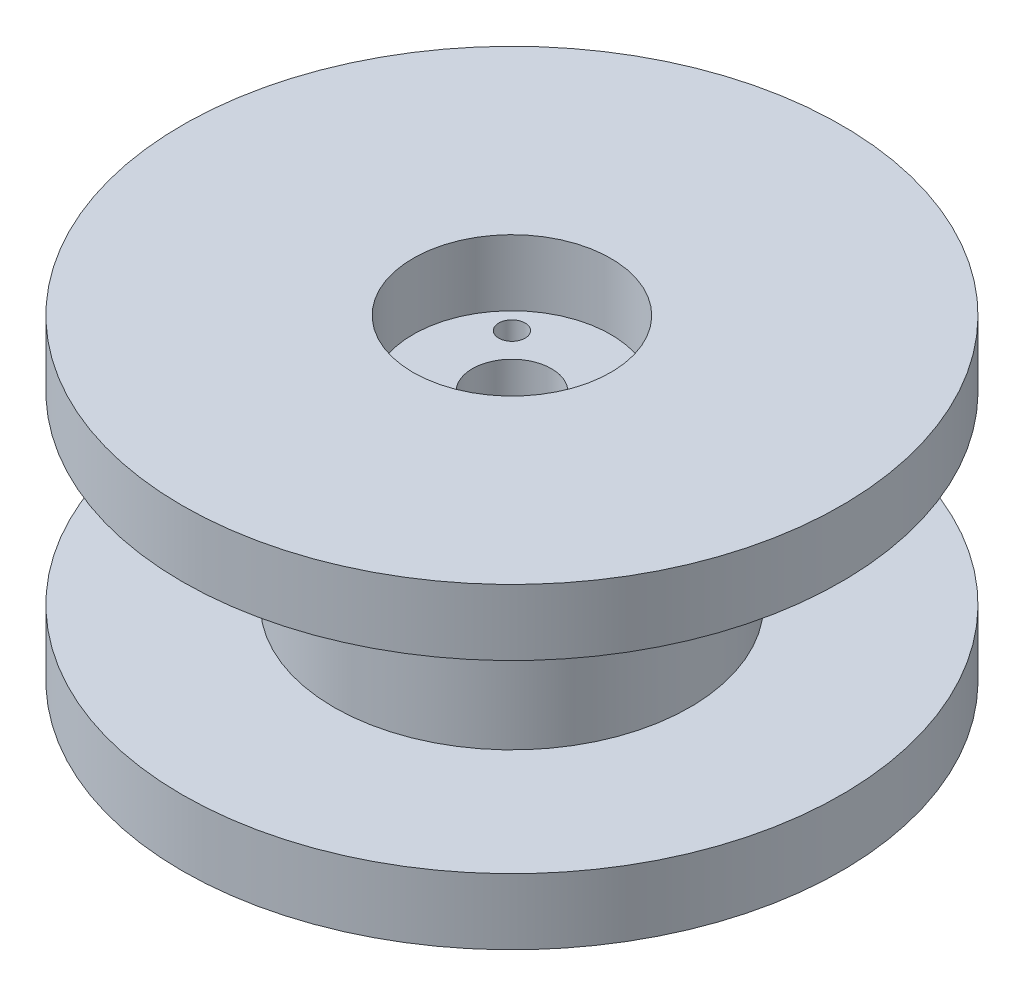
ISO-10303-21;
HEADER;
FILE_DESCRIPTION(('STEP AP214'),'2;1');
FILE_NAME('part.step','',(''),(''),'','','');
FILE_SCHEMA(('AUTOMOTIVE_DESIGN { 1 0 10303 214 1 1 1 1 }'));
ENDSEC;
DATA;
#1=APPLICATION_CONTEXT('core data for automotive mechanical design processes');
#2=APPLICATION_PROTOCOL_DEFINITION('international standard','automotive_design',2000,#1);
#3=PRODUCT_CONTEXT('',#1,'mechanical');
#4=PRODUCT('Part','Part','',(#3));
#5=PRODUCT_RELATED_PRODUCT_CATEGORY('part','',(#4));
#6=PRODUCT_DEFINITION_FORMATION('','',#4);
#7=PRODUCT_DEFINITION_CONTEXT('part definition',#1,'design');
#8=PRODUCT_DEFINITION('design','',#6,#7);
#9=PRODUCT_DEFINITION_SHAPE('','',#8);
#10=(LENGTH_UNIT() NAMED_UNIT(*) SI_UNIT(.MILLI.,.METRE.));
#11=(NAMED_UNIT(*) PLANE_ANGLE_UNIT() SI_UNIT($,.RADIAN.));
#12=(NAMED_UNIT(*) SI_UNIT($,.STERADIAN.) SOLID_ANGLE_UNIT());
#13=UNCERTAINTY_MEASURE_WITH_UNIT(LENGTH_MEASURE(1.E-05),#10,'distance_accuracy_value','');
#14=(GEOMETRIC_REPRESENTATION_CONTEXT(3) GLOBAL_UNCERTAINTY_ASSIGNED_CONTEXT((#13)) GLOBAL_UNIT_ASSIGNED_CONTEXT((#10,
#11,#12)) REPRESENTATION_CONTEXT('',''));
#15=CARTESIAN_POINT('',(0.,0.,0.));
#16=DIRECTION('',(0.,0.,1.));
#17=DIRECTION('',(1.,0.,0.));
#18=AXIS2_PLACEMENT_3D('',#15,#16,#17);
#19=CARTESIAN_POINT('',(0.,-7.,7.5));
#20=DIRECTION('',(0.,-1.,0.));
#21=DIRECTION('',(0.,0.,-1.));
#22=AXIS2_PLACEMENT_3D('',#19,#20,#21);
#23=PLANE('',#22);
#24=CARTESIAN_POINT('',(4.,-7.,4.));
#25=DIRECTION('',(0.,-1.,0.));
#26=DIRECTION('',(0.,0.,-1.));
#27=AXIS2_PLACEMENT_3D('',#24,#25,#26);
#28=CIRCLE('',#27,1.);
#29=CARTESIAN_POINT('',(4.,-7.,3.));
#30=VERTEX_POINT('',#29);
#31=EDGE_CURVE('E86',#30,#30,#28,.T.);
#32=ORIENTED_EDGE('',*,*,#31,.F.);
#33=EDGE_LOOP('',(#32));
#34=FACE_BOUND('',#33,.T.);
#35=CARTESIAN_POINT('',(-4.,-7.,4.));
#36=DIRECTION('',(0.,-1.,0.));
#37=DIRECTION('',(0.,0.,-1.));
#38=AXIS2_PLACEMENT_3D('',#35,#36,#37);
#39=CIRCLE('',#38,1.);
#40=CARTESIAN_POINT('',(-4.,-7.,3.));
#41=VERTEX_POINT('',#40);
#42=EDGE_CURVE('E72',#41,#41,#39,.T.);
#43=ORIENTED_EDGE('',*,*,#42,.F.);
#44=EDGE_LOOP('',(#43));
#45=FACE_BOUND('',#44,.T.);
#46=CARTESIAN_POINT('',(-4.,-7.,-4.));
#47=DIRECTION('',(0.,-1.,0.));
#48=DIRECTION('',(0.,0.,-1.));
#49=AXIS2_PLACEMENT_3D('',#46,#47,#48);
#50=CIRCLE('',#49,1.);
#51=CARTESIAN_POINT('',(-4.,-7.,-5.));
#52=VERTEX_POINT('',#51);
#53=EDGE_CURVE('E68',#52,#52,#50,.T.);
#54=ORIENTED_EDGE('',*,*,#53,.F.);
#55=EDGE_LOOP('',(#54));
#56=FACE_BOUND('',#55,.T.);
#57=CARTESIAN_POINT('',(4.,-7.,-4.));
#58=DIRECTION('',(0.,-1.,0.));
#59=DIRECTION('',(0.,0.,-1.));
#60=AXIS2_PLACEMENT_3D('',#57,#58,#59);
#61=CIRCLE('',#60,1.);
#62=CARTESIAN_POINT('',(4.,-7.,-5.));
#63=VERTEX_POINT('',#62);
#64=EDGE_CURVE('E64',#63,#63,#61,.T.);
#65=ORIENTED_EDGE('',*,*,#64,.F.);
#66=EDGE_LOOP('',(#65));
#67=FACE_BOUND('',#66,.T.);
#68=CARTESIAN_POINT('',(0.,-7.,0.));
#69=DIRECTION('',(0.,-1.,0.));
#70=DIRECTION('',(0.,0.,-1.));
#71=AXIS2_PLACEMENT_3D('',#68,#69,#70);
#72=CIRCLE('',#71,3.);
#73=CARTESIAN_POINT('',(0.,-7.,-3.));
#74=VERTEX_POINT('',#73);
#75=EDGE_CURVE('E59',#74,#74,#72,.T.);
#76=ORIENTED_EDGE('',*,*,#75,.F.);
#77=EDGE_LOOP('',(#76));
#78=FACE_BOUND('',#77,.T.);
#79=CARTESIAN_POINT('',(0.,-7.,0.));
#80=DIRECTION('',(0.,1.,0.));
#81=DIRECTION('',(0.,0.,1.));
#82=AXIS2_PLACEMENT_3D('',#79,#80,#81);
#83=CIRCLE('',#82,7.5);
#84=CARTESIAN_POINT('',(0.,-7.,7.5));
#85=VERTEX_POINT('',#84);
#86=EDGE_CURVE('E10',#85,#85,#83,.T.);
#87=ORIENTED_EDGE('',*,*,#86,.F.);
#88=EDGE_LOOP('',(#87));
#89=FACE_BOUND('',#88,.T.);
#90=ADVANCED_FACE('F37',(#34,#45,#56,#67,#78,#89),#23,.T.);
#91=CARTESIAN_POINT('',(0.,7.,0.));
#92=DIRECTION('',(0.,1.,0.));
#93=DIRECTION('',(0.,0.,1.));
#94=AXIS2_PLACEMENT_3D('',#91,#92,#93);
#95=CYLINDRICAL_SURFACE('',#94,7.5);
#96=ORIENTED_EDGE('',*,*,#86,.T.);
#97=EDGE_LOOP('',(#96));
#98=FACE_BOUND('',#97,.T.);
#99=CARTESIAN_POINT('',(0.,-12.,0.));
#100=DIRECTION('',(0.,1.,0.));
#101=DIRECTION('',(0.,0.,1.));
#102=AXIS2_PLACEMENT_3D('',#99,#100,#101);
#103=CIRCLE('',#102,7.5);
#104=CARTESIAN_POINT('',(0.,-12.,7.5));
#105=VERTEX_POINT('',#104);
#106=EDGE_CURVE('E45',#105,#105,#103,.T.);
#107=ORIENTED_EDGE('',*,*,#106,.F.);
#108=EDGE_LOOP('',(#107));
#109=FACE_BOUND('',#108,.T.);
#110=ADVANCED_FACE('F126',(#98,#109),#95,.F.);
#111=CARTESIAN_POINT('',(0.,-12.,7.5));
#112=DIRECTION('',(0.,-1.,0.));
#113=DIRECTION('',(0.,0.,-1.));
#114=AXIS2_PLACEMENT_3D('',#111,#112,#113);
#115=PLANE('',#114);
#116=ORIENTED_EDGE('',*,*,#106,.T.);
#117=EDGE_LOOP('',(#116));
#118=FACE_BOUND('',#117,.T.);
#119=CARTESIAN_POINT('',(0.,-12.,0.));
#120=DIRECTION('',(0.,1.,0.));
#121=DIRECTION('',(0.,0.,1.));
#122=AXIS2_PLACEMENT_3D('',#119,#120,#121);
#123=CIRCLE('',#122,25.);
#124=CARTESIAN_POINT('',(0.,-12.,25.));
#125=VERTEX_POINT('',#124);
#126=EDGE_CURVE('E51',#125,#125,#123,.T.);
#127=ORIENTED_EDGE('',*,*,#126,.F.);
#128=EDGE_LOOP('',(#127));
#129=FACE_BOUND('',#128,.T.);
#130=ADVANCED_FACE('F124',(#118,#129),#115,.T.);
#131=CARTESIAN_POINT('',(0.,7.,0.));
#132=DIRECTION('',(0.,1.,0.));
#133=DIRECTION('',(0.,0.,1.));
#134=AXIS2_PLACEMENT_3D('',#131,#132,#133);
#135=CYLINDRICAL_SURFACE('',#134,25.);
#136=ORIENTED_EDGE('',*,*,#126,.T.);
#137=EDGE_LOOP('',(#136));
#138=FACE_BOUND('',#137,.T.);
#139=CARTESIAN_POINT('',(0.,-7.,0.));
#140=DIRECTION('',(0.,1.,0.));
#141=DIRECTION('',(0.,0.,1.));
#142=AXIS2_PLACEMENT_3D('',#139,#140,#141);
#143=CIRCLE('',#142,25.);
#144=CARTESIAN_POINT('',(0.,-7.,25.));
#145=VERTEX_POINT('',#144);
#146=EDGE_CURVE('E114',#145,#145,#143,.T.);
#147=ORIENTED_EDGE('',*,*,#146,.F.);
#148=EDGE_LOOP('',(#147));
#149=FACE_BOUND('',#148,.T.);
#150=ADVANCED_FACE('F121',(#138,#149),#135,.T.);
#151=CARTESIAN_POINT('',(0.,-7.,25.));
#152=DIRECTION('',(0.,1.,0.));
#153=DIRECTION('',(0.,0.,1.));
#154=AXIS2_PLACEMENT_3D('',#151,#152,#153);
#155=PLANE('',#154);
#156=ORIENTED_EDGE('',*,*,#146,.T.);
#157=EDGE_LOOP('',(#156));
#158=FACE_BOUND('',#157,.T.);
#159=CARTESIAN_POINT('',(0.,-7.,0.));
#160=DIRECTION('',(0.,1.,0.));
#161=DIRECTION('',(0.,0.,1.));
#162=AXIS2_PLACEMENT_3D('',#159,#160,#161);
#163=CIRCLE('',#162,13.5);
#164=CARTESIAN_POINT('',(0.,-7.,13.5));
#165=VERTEX_POINT('',#164);
#166=EDGE_CURVE('E110',#165,#165,#163,.T.);
#167=ORIENTED_EDGE('',*,*,#166,.F.);
#168=EDGE_LOOP('',(#167));
#169=FACE_BOUND('',#168,.T.);
#170=ADVANCED_FACE('F133',(#158,#169),#155,.T.);
#171=CARTESIAN_POINT('',(0.,7.,0.));
#172=DIRECTION('',(0.,1.,0.));
#173=DIRECTION('',(0.,0.,1.));
#174=AXIS2_PLACEMENT_3D('',#171,#172,#173);
#175=CYLINDRICAL_SURFACE('',#174,13.5);
#176=ORIENTED_EDGE('',*,*,#166,.T.);
#177=EDGE_LOOP('',(#176));
#178=FACE_BOUND('',#177,.T.);
#179=CARTESIAN_POINT('',(0.,6.99999999999999,0.));
#180=DIRECTION('',(0.,1.,0.));
#181=DIRECTION('',(0.,0.,1.));
#182=AXIS2_PLACEMENT_3D('',#179,#180,#181);
#183=CIRCLE('',#182,13.5);
#184=CARTESIAN_POINT('',(0.,6.99999999999999,13.5));
#185=VERTEX_POINT('',#184);
#186=EDGE_CURVE('E106',#185,#185,#183,.T.);
#187=ORIENTED_EDGE('',*,*,#186,.F.);
#188=EDGE_LOOP('',(#187));
#189=FACE_BOUND('',#188,.T.);
#190=ADVANCED_FACE('F190',(#178,#189),#175,.T.);
#191=CARTESIAN_POINT('',(0.,7.,25.));
#192=DIRECTION('',(0.,-1.,0.));
#193=DIRECTION('',(0.,0.,-1.));
#194=AXIS2_PLACEMENT_3D('',#191,#192,#193);
#195=PLANE('',#194);
#196=ORIENTED_EDGE('',*,*,#186,.T.);
#197=EDGE_LOOP('',(#196));
#198=FACE_BOUND('',#197,.T.);
#199=CARTESIAN_POINT('',(0.,7.,0.));
#200=DIRECTION('',(0.,1.,0.));
#201=DIRECTION('',(0.,0.,1.));
#202=AXIS2_PLACEMENT_3D('',#199,#200,#201);
#203=CIRCLE('',#202,25.);
#204=CARTESIAN_POINT('',(0.,7.,25.));
#205=VERTEX_POINT('',#204);
#206=EDGE_CURVE('E102',#205,#205,#203,.T.);
#207=ORIENTED_EDGE('',*,*,#206,.F.);
#208=EDGE_LOOP('',(#207));
#209=FACE_BOUND('',#208,.T.);
#210=ADVANCED_FACE('F186',(#198,#209),#195,.T.);
#211=CARTESIAN_POINT('',(0.,7.,0.));
#212=DIRECTION('',(0.,1.,0.));
#213=DIRECTION('',(0.,0.,1.));
#214=AXIS2_PLACEMENT_3D('',#211,#212,#213);
#215=CYLINDRICAL_SURFACE('',#214,25.);
#216=ORIENTED_EDGE('',*,*,#206,.T.);
#217=EDGE_LOOP('',(#216));
#218=FACE_BOUND('',#217,.T.);
#219=CARTESIAN_POINT('',(0.,12.,0.));
#220=DIRECTION('',(0.,1.,0.));
#221=DIRECTION('',(0.,0.,1.));
#222=AXIS2_PLACEMENT_3D('',#219,#220,#221);
#223=CIRCLE('',#222,25.);
#224=CARTESIAN_POINT('',(0.,12.,25.));
#225=VERTEX_POINT('',#224);
#226=EDGE_CURVE('E98',#225,#225,#223,.T.);
#227=ORIENTED_EDGE('',*,*,#226,.F.);
#228=EDGE_LOOP('',(#227));
#229=FACE_BOUND('',#228,.T.);
#230=ADVANCED_FACE('F179',(#218,#229),#215,.T.);
#231=CARTESIAN_POINT('',(0.,12.,7.5));
#232=DIRECTION('',(0.,1.,0.));
#233=DIRECTION('',(0.,0.,1.));
#234=AXIS2_PLACEMENT_3D('',#231,#232,#233);
#235=PLANE('',#234);
#236=ORIENTED_EDGE('',*,*,#226,.T.);
#237=EDGE_LOOP('',(#236));
#238=FACE_BOUND('',#237,.T.);
#239=CARTESIAN_POINT('',(0.,12.,0.));
#240=DIRECTION('',(0.,1.,0.));
#241=DIRECTION('',(0.,0.,1.));
#242=AXIS2_PLACEMENT_3D('',#239,#240,#241);
#243=CIRCLE('',#242,7.5);
#244=CARTESIAN_POINT('',(0.,12.,7.5));
#245=VERTEX_POINT('',#244);
#246=EDGE_CURVE('E94',#245,#245,#243,.T.);
#247=ORIENTED_EDGE('',*,*,#246,.F.);
#248=EDGE_LOOP('',(#247));
#249=FACE_BOUND('',#248,.T.);
#250=ADVANCED_FACE('F173',(#238,#249),#235,.T.);
#251=CARTESIAN_POINT('',(0.,7.,0.));
#252=DIRECTION('',(0.,1.,0.));
#253=DIRECTION('',(0.,0.,1.));
#254=AXIS2_PLACEMENT_3D('',#251,#252,#253);
#255=CYLINDRICAL_SURFACE('',#254,7.5);
#256=ORIENTED_EDGE('',*,*,#246,.T.);
#257=EDGE_LOOP('',(#256));
#258=FACE_BOUND('',#257,.T.);
#259=CARTESIAN_POINT('',(0.,7.,0.));
#260=DIRECTION('',(0.,1.,0.));
#261=DIRECTION('',(0.,0.,1.));
#262=AXIS2_PLACEMENT_3D('',#259,#260,#261);
#263=CIRCLE('',#262,7.5);
#264=CARTESIAN_POINT('',(0.,7.,7.5));
#265=VERTEX_POINT('',#264);
#266=EDGE_CURVE('E90',#265,#265,#263,.T.);
#267=ORIENTED_EDGE('',*,*,#266,.F.);
#268=EDGE_LOOP('',(#267));
#269=FACE_BOUND('',#268,.T.);
#270=ADVANCED_FACE('F165',(#258,#269),#255,.F.);
#271=CARTESIAN_POINT('',(0.,7.,7.5));
#272=DIRECTION('',(0.,1.,0.));
#273=DIRECTION('',(0.,0.,1.));
#274=AXIS2_PLACEMENT_3D('',#271,#272,#273);
#275=PLANE('',#274);
#276=CARTESIAN_POINT('',(4.,7.,4.));
#277=DIRECTION('',(0.,1.,0.));
#278=DIRECTION('',(0.,0.,1.));
#279=AXIS2_PLACEMENT_3D('',#276,#277,#278);
#280=CIRCLE('',#279,1.);
#281=CARTESIAN_POINT('',(4.,7.,5.));
#282=VERTEX_POINT('',#281);
#283=EDGE_CURVE('E40',#282,#282,#280,.T.);
#284=ORIENTED_EDGE('',*,*,#283,.F.);
#285=EDGE_LOOP('',(#284));
#286=FACE_BOUND('',#285,.T.);
#287=CARTESIAN_POINT('',(-4.,7.,4.));
#288=DIRECTION('',(0.,1.,0.));
#289=DIRECTION('',(0.,0.,1.));
#290=AXIS2_PLACEMENT_3D('',#287,#288,#289);
#291=CIRCLE('',#290,1.);
#292=CARTESIAN_POINT('',(-4.,7.,5.));
#293=VERTEX_POINT('',#292);
#294=EDGE_CURVE('E69',#293,#293,#291,.T.);
#295=ORIENTED_EDGE('',*,*,#294,.F.);
#296=EDGE_LOOP('',(#295));
#297=FACE_BOUND('',#296,.T.);
#298=CARTESIAN_POINT('',(-4.,7.,-4.));
#299=DIRECTION('',(0.,1.,0.));
#300=DIRECTION('',(0.,0.,1.));
#301=AXIS2_PLACEMENT_3D('',#298,#299,#300);
#302=CIRCLE('',#301,1.);
#303=CARTESIAN_POINT('',(-4.,7.,-3.));
#304=VERTEX_POINT('',#303);
#305=EDGE_CURVE('E65',#304,#304,#302,.T.);
#306=ORIENTED_EDGE('',*,*,#305,.F.);
#307=EDGE_LOOP('',(#306));
#308=FACE_BOUND('',#307,.T.);
#309=CARTESIAN_POINT('',(4.,7.,-4.));
#310=DIRECTION('',(0.,1.,0.));
#311=DIRECTION('',(0.,0.,1.));
#312=AXIS2_PLACEMENT_3D('',#309,#310,#311);
#313=CIRCLE('',#312,1.);
#314=CARTESIAN_POINT('',(4.,7.,-3.));
#315=VERTEX_POINT('',#314);
#316=EDGE_CURVE('E60',#315,#315,#313,.T.);
#317=ORIENTED_EDGE('',*,*,#316,.F.);
#318=EDGE_LOOP('',(#317));
#319=FACE_BOUND('',#318,.T.);
#320=CARTESIAN_POINT('',(0.,7.,0.));
#321=DIRECTION('',(0.,1.,0.));
#322=DIRECTION('',(0.,0.,1.));
#323=AXIS2_PLACEMENT_3D('',#320,#321,#322);
#324=CIRCLE('',#323,3.);
#325=CARTESIAN_POINT('',(0.,7.,3.));
#326=VERTEX_POINT('',#325);
#327=EDGE_CURVE('E55',#326,#326,#324,.T.);
#328=ORIENTED_EDGE('',*,*,#327,.F.);
#329=EDGE_LOOP('',(#328));
#330=FACE_BOUND('',#329,.T.);
#331=ORIENTED_EDGE('',*,*,#266,.T.);
#332=EDGE_LOOP('',(#331));
#333=FACE_BOUND('',#332,.T.);
#334=ADVANCED_FACE('F162',(#286,#297,#308,#319,#330,#333),#275,.T.);
#335=CARTESIAN_POINT('',(0.,12.,0.));
#336=DIRECTION('',(0.,-1.,0.));
#337=DIRECTION('',(0.,0.,-1.));
#338=AXIS2_PLACEMENT_3D('',#335,#336,#337);
#339=CYLINDRICAL_SURFACE('',#338,3.);
#340=ORIENTED_EDGE('',*,*,#75,.T.);
#341=EDGE_LOOP('',(#340));
#342=FACE_BOUND('',#341,.T.);
#343=ORIENTED_EDGE('',*,*,#327,.T.);
#344=EDGE_LOOP('',(#343));
#345=FACE_BOUND('',#344,.T.);
#346=ADVANCED_FACE('F158',(#342,#345),#339,.F.);
#347=CARTESIAN_POINT('',(4.,12.,-4.));
#348=DIRECTION('',(0.,-1.,0.));
#349=DIRECTION('',(0.,0.,-1.));
#350=AXIS2_PLACEMENT_3D('',#347,#348,#349);
#351=CYLINDRICAL_SURFACE('',#350,1.);
#352=ORIENTED_EDGE('',*,*,#64,.T.);
#353=EDGE_LOOP('',(#352));
#354=FACE_BOUND('',#353,.T.);
#355=ORIENTED_EDGE('',*,*,#316,.T.);
#356=EDGE_LOOP('',(#355));
#357=FACE_BOUND('',#356,.T.);
#358=ADVANCED_FACE('F154',(#354,#357),#351,.F.);
#359=CARTESIAN_POINT('',(-4.,12.,-4.));
#360=DIRECTION('',(0.,-1.,0.));
#361=DIRECTION('',(0.,0.,-1.));
#362=AXIS2_PLACEMENT_3D('',#359,#360,#361);
#363=CYLINDRICAL_SURFACE('',#362,1.);
#364=ORIENTED_EDGE('',*,*,#53,.T.);
#365=EDGE_LOOP('',(#364));
#366=FACE_BOUND('',#365,.T.);
#367=ORIENTED_EDGE('',*,*,#305,.T.);
#368=EDGE_LOOP('',(#367));
#369=FACE_BOUND('',#368,.T.);
#370=ADVANCED_FACE('F157',(#366,#369),#363,.F.);
#371=CARTESIAN_POINT('',(-4.,12.,4.));
#372=DIRECTION('',(0.,-1.,0.));
#373=DIRECTION('',(0.,0.,-1.));
#374=AXIS2_PLACEMENT_3D('',#371,#372,#373);
#375=CYLINDRICAL_SURFACE('',#374,1.);
#376=ORIENTED_EDGE('',*,*,#42,.T.);
#377=EDGE_LOOP('',(#376));
#378=FACE_BOUND('',#377,.T.);
#379=ORIENTED_EDGE('',*,*,#294,.T.);
#380=EDGE_LOOP('',(#379));
#381=FACE_BOUND('',#380,.T.);
#382=ADVANCED_FACE('F265',(#378,#381),#375,.F.);
#383=CARTESIAN_POINT('',(4.,12.,4.));
#384=DIRECTION('',(0.,-1.,0.));
#385=DIRECTION('',(0.,0.,-1.));
#386=AXIS2_PLACEMENT_3D('',#383,#384,#385);
#387=CYLINDRICAL_SURFACE('',#386,1.);
#388=ORIENTED_EDGE('',*,*,#31,.T.);
#389=EDGE_LOOP('',(#388));
#390=FACE_BOUND('',#389,.T.);
#391=ORIENTED_EDGE('',*,*,#283,.T.);
#392=EDGE_LOOP('',(#391));
#393=FACE_BOUND('',#392,.T.);
#394=ADVANCED_FACE('F274',(#390,#393),#387,.F.);
#395=CLOSED_SHELL('',(#90,#110,#130,#150,#170,#190,#210,#230,#250,#270,#334,#346,#358,#370,#382,#394));
#396=MANIFOLD_SOLID_BREP('B2',#395);
#397=ADVANCED_BREP_SHAPE_REPRESENTATION('',(#18,#396),#14);
#398=SHAPE_DEFINITION_REPRESENTATION(#9,#397);
ENDSEC;
END-ISO-10303-21;
